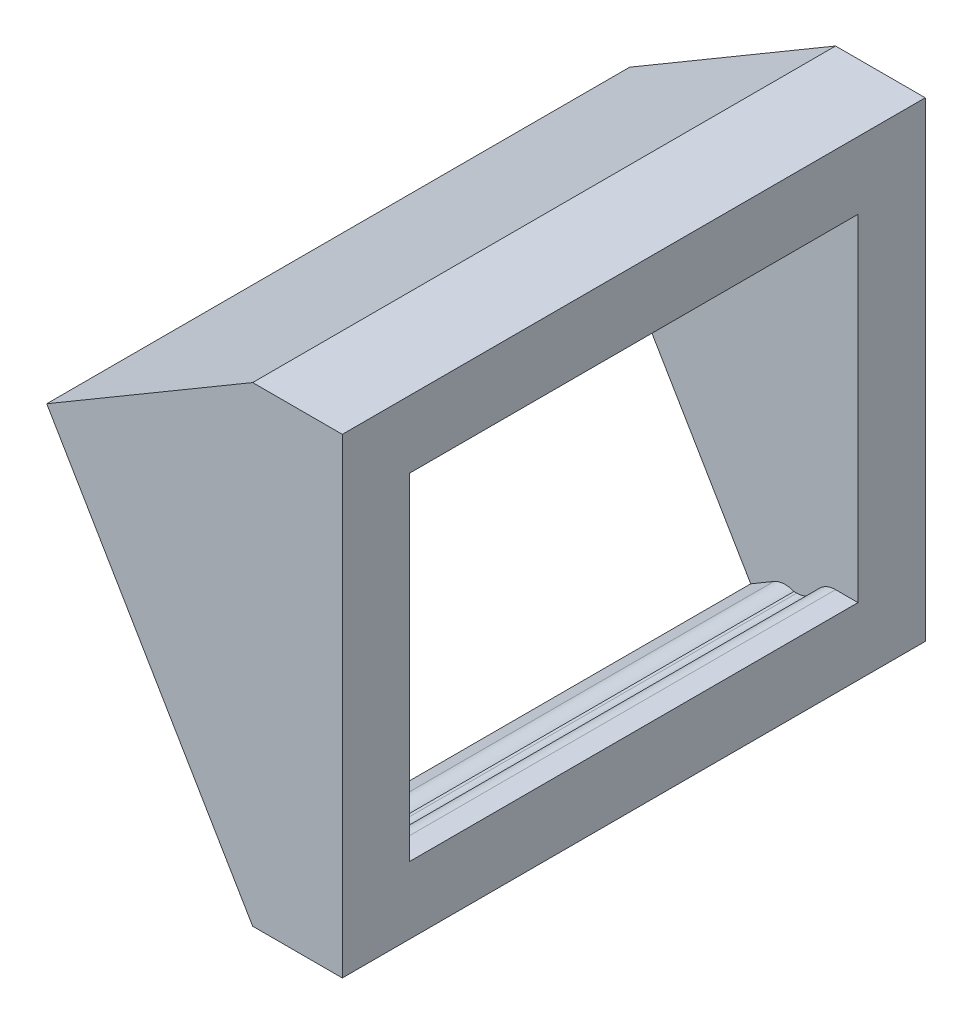
ISO-10303-21;
HEADER;
FILE_DESCRIPTION(('STEP AP214'),'2;1');
FILE_NAME('part.step','',(''),(''),'','','');
FILE_SCHEMA(('AUTOMOTIVE_DESIGN { 1 0 10303 214 1 1 1 1 }'));
ENDSEC;
DATA;
#1=APPLICATION_CONTEXT('core data for automotive mechanical design processes');
#2=APPLICATION_PROTOCOL_DEFINITION('international standard','automotive_design',2000,#1);
#3=PRODUCT_CONTEXT('',#1,'mechanical');
#4=PRODUCT('Part','Part','',(#3));
#5=PRODUCT_RELATED_PRODUCT_CATEGORY('part','',(#4));
#6=PRODUCT_DEFINITION_FORMATION('','',#4);
#7=PRODUCT_DEFINITION_CONTEXT('part definition',#1,'design');
#8=PRODUCT_DEFINITION('design','',#6,#7);
#9=PRODUCT_DEFINITION_SHAPE('','',#8);
#10=(LENGTH_UNIT() NAMED_UNIT(*) SI_UNIT(.MILLI.,.METRE.));
#11=(NAMED_UNIT(*) PLANE_ANGLE_UNIT() SI_UNIT($,.RADIAN.));
#12=(NAMED_UNIT(*) SI_UNIT($,.STERADIAN.) SOLID_ANGLE_UNIT());
#13=UNCERTAINTY_MEASURE_WITH_UNIT(LENGTH_MEASURE(1.E-05),#10,'distance_accuracy_value','');
#14=(GEOMETRIC_REPRESENTATION_CONTEXT(3) GLOBAL_UNCERTAINTY_ASSIGNED_CONTEXT((#13)) GLOBAL_UNIT_ASSIGNED_CONTEXT((#10,
#11,#12)) REPRESENTATION_CONTEXT('',''));
#15=CARTESIAN_POINT('',(0.,0.,0.));
#16=DIRECTION('',(0.,0.,1.));
#17=DIRECTION('',(1.,0.,0.));
#18=AXIS2_PLACEMENT_3D('',#15,#16,#17);
#19=CARTESIAN_POINT('',(2.,1.,11.5));
#20=DIRECTION('',(0.,1.,0.));
#21=DIRECTION('',(0.,0.,1.));
#22=AXIS2_PLACEMENT_3D('',#19,#20,#21);
#23=PLANE('',#22);
#24=DIRECTION('',(1.,0.,0.));
#25=VECTOR('',#24,1.);
#26=CARTESIAN_POINT('',(2.,1.,11.5));
#27=LINE('',#26,#25);
#28=CARTESIAN_POINT('',(0.5715522227985,1.,11.5));
#29=VERTEX_POINT('',#28);
#30=CARTESIAN_POINT('',(0.633974596215562,1.,11.5));
#31=VERTEX_POINT('',#30);
#32=EDGE_CURVE('E256',#29,#31,#27,.T.);
#33=ORIENTED_EDGE('',*,*,#32,.T.);
#34=DIRECTION('',(0.,0.,-1.));
#35=VECTOR('',#34,1.);
#36=CARTESIAN_POINT('',(0.633974596215562,1.,1.5));
#37=LINE('',#36,#35);
#38=CARTESIAN_POINT('',(0.633974596215562,1.,1.5));
#39=VERTEX_POINT('',#38);
#40=EDGE_CURVE('E345',#31,#39,#37,.T.);
#41=ORIENTED_EDGE('',*,*,#40,.T.);
#42=DIRECTION('',(1.,0.,0.));
#43=VECTOR('',#42,1.);
#44=CARTESIAN_POINT('',(2.,1.,1.5));
#45=LINE('',#44,#43);
#46=CARTESIAN_POINT('',(0.5715522227985,1.,1.5));
#47=VERTEX_POINT('',#46);
#48=EDGE_CURVE('E255',#47,#39,#45,.T.);
#49=ORIENTED_EDGE('',*,*,#48,.F.);
#50=DIRECTION('',(0.,0.,-1.));
#51=VECTOR('',#50,1.);
#52=CARTESIAN_POINT('',(0.5715522227985,1.,11.5));
#53=LINE('',#52,#51);
#54=EDGE_CURVE('E265',#29,#47,#53,.T.);
#55=ORIENTED_EDGE('',*,*,#54,.F.);
#56=EDGE_LOOP('',(#33,#41,#49,#55));
#57=FACE_BOUND('',#56,.T.);
#58=ADVANCED_FACE('F63',(#57),#23,.T.);
#59=CARTESIAN_POINT('',(0.,9.5,11.5));
#60=DIRECTION('',(0.,-1.,0.));
#61=DIRECTION('',(0.,0.,-1.));
#62=AXIS2_PLACEMENT_3D('',#59,#60,#61);
#63=PLANE('',#62);
#64=DIRECTION('',(-1.,0.,0.));
#65=VECTOR('',#64,1.);
#66=CARTESIAN_POINT('',(0.,9.5,1.5));
#67=LINE('',#66,#65);
#68=CARTESIAN_POINT('',(0.633974596215561,9.5,1.5));
#69=VERTEX_POINT('',#68);
#70=CARTESIAN_POINT('',(0.272627133216455,9.5,1.5));
#71=VERTEX_POINT('',#70);
#72=EDGE_CURVE('E268',#69,#71,#67,.T.);
#73=ORIENTED_EDGE('',*,*,#72,.F.);
#74=DIRECTION('',(0.,0.,1.));
#75=VECTOR('',#74,1.);
#76=CARTESIAN_POINT('',(0.633974596215561,9.5,11.5));
#77=LINE('',#76,#75);
#78=CARTESIAN_POINT('',(0.633974596215561,9.5,11.5));
#79=VERTEX_POINT('',#78);
#80=EDGE_CURVE('E339',#69,#79,#77,.T.);
#81=ORIENTED_EDGE('',*,*,#80,.T.);
#82=DIRECTION('',(-1.,0.,0.));
#83=VECTOR('',#82,1.);
#84=CARTESIAN_POINT('',(0.,9.5,11.5));
#85=LINE('',#84,#83);
#86=CARTESIAN_POINT('',(0.272627133216455,9.5,11.5));
#87=VERTEX_POINT('',#86);
#88=EDGE_CURVE('E259',#79,#87,#85,.T.);
#89=ORIENTED_EDGE('',*,*,#88,.T.);
#90=DIRECTION('',(0.,0.,-1.));
#91=VECTOR('',#90,1.);
#92=CARTESIAN_POINT('',(0.272627133216455,9.5,11.5));
#93=LINE('',#92,#91);
#94=EDGE_CURVE('E274',#87,#71,#93,.T.);
#95=ORIENTED_EDGE('',*,*,#94,.T.);
#96=EDGE_LOOP('',(#73,#81,#89,#95));
#97=FACE_BOUND('',#96,.T.);
#98=ADVANCED_FACE('F409',(#97),#63,.T.);
#99=CARTESIAN_POINT('',(-4.08418235971319,6.93368851358104,11.5));
#100=DIRECTION('',(0.507531692345614,-0.86163308969932,0.));
#101=DIRECTION('',(0.86163308969932,0.507531692345615,0.));
#102=AXIS2_PLACEMENT_3D('',#99,#100,#101);
#103=PLANE('',#102);
#104=DIRECTION('',(-0.86163308969932,-0.507531692345614,0.));
#105=VECTOR('',#104,1.);
#106=CARTESIAN_POINT('',(-4.08418235971319,6.93368851358104,11.5));
#107=LINE('',#106,#105);
#108=CARTESIAN_POINT('',(-2.86194020665817,7.65363141713484,11.5));
#109=VERTEX_POINT('',#108);
#110=EDGE_CURVE('E262',#87,#109,#107,.T.);
#111=ORIENTED_EDGE('',*,*,#110,.T.);
#112=DIRECTION('',(0.,0.,-1.));
#113=VECTOR('',#112,1.);
#114=CARTESIAN_POINT('',(-2.86194020665817,7.65363141713484,1.5));
#115=LINE('',#114,#113);
#116=CARTESIAN_POINT('',(-2.86194020665817,7.65363141713484,1.5));
#117=VERTEX_POINT('',#116);
#118=EDGE_CURVE('E350',#109,#117,#115,.T.);
#119=ORIENTED_EDGE('',*,*,#118,.T.);
#120=DIRECTION('',(-0.86163308969932,-0.507531692345614,0.));
#121=VECTOR('',#120,1.);
#122=CARTESIAN_POINT('',(-4.08418235971319,6.93368851358104,1.5));
#123=LINE('',#122,#121);
#124=EDGE_CURVE('E260',#71,#117,#123,.T.);
#125=ORIENTED_EDGE('',*,*,#124,.F.);
#126=ORIENTED_EDGE('',*,*,#94,.F.);
#127=EDGE_LOOP('',(#111,#119,#125,#126));
#128=FACE_BOUND('',#127,.T.);
#129=ADVANCED_FACE('F366',(#128),#103,.T.);
#130=CARTESIAN_POINT('',(0.,0.,11.5));
#131=DIRECTION('',(0.,0.,1.));
#132=DIRECTION('',(1.,0.,0.));
#133=AXIS2_PLACEMENT_3D('',#130,#131,#132);
#134=PLANE('',#133);
#135=ORIENTED_EDGE('',*,*,#88,.F.);
#136=CARTESIAN_POINT('',(0.633974596215561,9.,11.5));
#137=DIRECTION('',(0.,0.,1.));
#138=DIRECTION('',(1.,0.,0.));
#139=AXIS2_PLACEMENT_3D('',#136,#137,#138);
#140=CIRCLE('',#139,0.5);
#141=CARTESIAN_POINT('',(1.06698729810778,9.25,11.5));
#142=VERTEX_POINT('',#141);
#143=EDGE_CURVE('E343',#79,#142,#140,.F.);
#144=ORIENTED_EDGE('',*,*,#143,.T.);
#145=CARTESIAN_POINT('',(1.5,9.5,11.5));
#146=DIRECTION('',(0.,0.,1.));
#147=DIRECTION('',(1.,0.,0.));
#148=AXIS2_PLACEMENT_3D('',#145,#146,#147);
#149=CIRCLE('',#148,0.5);
#150=CARTESIAN_POINT('',(1.5,9.,11.5));
#151=VERTEX_POINT('',#150);
#152=EDGE_CURVE('E323',#142,#151,#149,.T.);
#153=ORIENTED_EDGE('',*,*,#152,.T.);
#154=DIRECTION('',(1.,0.,0.));
#155=VECTOR('',#154,1.);
#156=CARTESIAN_POINT('',(-11.5,9.,11.5));
#157=LINE('',#156,#155);
#158=CARTESIAN_POINT('',(2.,9.,11.5));
#159=VERTEX_POINT('',#158);
#160=EDGE_CURVE('E210',#151,#159,#157,.T.);
#161=ORIENTED_EDGE('',*,*,#160,.T.);
#162=DIRECTION('',(0.,-1.,0.));
#163=VECTOR('',#162,1.);
#164=CARTESIAN_POINT('',(2.,1.5,11.5));
#165=LINE('',#164,#163);
#166=CARTESIAN_POINT('',(2.,1.5,11.5));
#167=VERTEX_POINT('',#166);
#168=EDGE_CURVE('E225',#159,#167,#165,.T.);
#169=ORIENTED_EDGE('',*,*,#168,.T.);
#170=DIRECTION('',(1.,0.,0.));
#171=VECTOR('',#170,1.);
#172=CARTESIAN_POINT('',(-11.5,1.5,11.5));
#173=LINE('',#172,#171);
#174=CARTESIAN_POINT('',(1.5,1.5,11.5));
#175=VERTEX_POINT('',#174);
#176=EDGE_CURVE('E243',#175,#167,#173,.T.);
#177=ORIENTED_EDGE('',*,*,#176,.F.);
#178=CARTESIAN_POINT('',(1.5,0.999999999999999,11.5));
#179=DIRECTION('',(0.,0.,1.));
#180=DIRECTION('',(1.,0.,0.));
#181=AXIS2_PLACEMENT_3D('',#178,#179,#180);
#182=CIRCLE('',#181,0.5);
#183=CARTESIAN_POINT('',(1.06698729810778,1.25,11.5));
#184=VERTEX_POINT('',#183);
#185=EDGE_CURVE('E329',#175,#184,#182,.T.);
#186=ORIENTED_EDGE('',*,*,#185,.T.);
#187=CARTESIAN_POINT('',(0.633974596215562,1.5,11.5));
#188=DIRECTION('',(0.,0.,1.));
#189=DIRECTION('',(1.,0.,0.));
#190=AXIS2_PLACEMENT_3D('',#187,#188,#189);
#191=CIRCLE('',#190,0.5);
#192=EDGE_CURVE('E341',#184,#31,#191,.F.);
#193=ORIENTED_EDGE('',*,*,#192,.T.);
#194=ORIENTED_EDGE('',*,*,#32,.F.);
#195=CARTESIAN_POINT('',(0.376833029105326,0.539473740588574,11.5));
#196=DIRECTION('',(0.,0.,1.));
#197=DIRECTION('',(1.,0.,0.));
#198=AXIS2_PLACEMENT_3D('',#195,#196,#197);
#199=CIRCLE('',#198,0.5);
#200=CARTESIAN_POINT('',(0.123067182932517,0.970290285438232,11.5));
#201=VERTEX_POINT('',#200);
#202=EDGE_CURVE('E71',#29,#201,#199,.T.);
#203=ORIENTED_EDGE('',*,*,#202,.T.);
#204=DIRECTION('',(-0.86163308969932,-0.507531692345615,0.));
#205=VECTOR('',#204,1.);
#206=CARTESIAN_POINT('',(11.2394335312075,7.51821456193354,11.5));
#207=LINE('',#206,#205);
#208=CARTESIAN_POINT('',(-0.392613179733349,0.666536715267733,11.5));
#209=VERTEX_POINT('',#208);
#210=EDGE_CURVE('E233',#201,#209,#207,.T.);
#211=ORIENTED_EDGE('',*,*,#210,.T.);
#212=DIRECTION('',(-0.507531692345615,0.86163308969932,0.));
#213=VECTOR('',#212,1.);
#214=CARTESIAN_POINT('',(-0.392613179733349,0.666536715267733,11.5));
#215=LINE('',#214,#213);
#216=CARTESIAN_POINT('',(-4.19910087232546,7.12878488801263,11.5));
#217=VERTEX_POINT('',#216);
#218=EDGE_CURVE('E234',#209,#217,#215,.T.);
#219=ORIENTED_EDGE('',*,*,#218,.T.);
#220=DIRECTION('',(-0.86163308969932,-0.507531692345615,0.));
#221=VECTOR('',#220,1.);
#222=CARTESIAN_POINT('',(7.43294583861536,13.9804627346784,11.5));
#223=LINE('',#222,#221);
#224=CARTESIAN_POINT('',(-3.33746778262614,7.63631658035825,11.5));
#225=VERTEX_POINT('',#224);
#226=EDGE_CURVE('E248',#225,#217,#223,.T.);
#227=ORIENTED_EDGE('',*,*,#226,.F.);
#228=CARTESIAN_POINT('',(-3.11570605283098,8.0844479619845,11.5));
#229=DIRECTION('',(0.,0.,1.));
#230=DIRECTION('',(1.,0.,0.));
#231=AXIS2_PLACEMENT_3D('',#228,#229,#230);
#232=CIRCLE('',#231,0.5);
#233=EDGE_CURVE('E356',#225,#109,#232,.T.);
#234=ORIENTED_EDGE('',*,*,#233,.T.);
#235=ORIENTED_EDGE('',*,*,#110,.F.);
#236=EDGE_LOOP('',(#135,#144,#153,#161,#169,#177,#186,#193,#194,#203,#211,#219,#227,#234,#235));
#237=FACE_BOUND('',#236,.T.);
#238=ADVANCED_FACE('F361',(#237),#134,.F.);
#239=CARTESIAN_POINT('',(0.,0.,1.5));
#240=DIRECTION('',(0.,0.,1.));
#241=DIRECTION('',(1.,0.,0.));
#242=AXIS2_PLACEMENT_3D('',#239,#240,#241);
#243=PLANE('',#242);
#244=CARTESIAN_POINT('',(1.5,9.5,1.5));
#245=DIRECTION('',(0.,0.,1.));
#246=DIRECTION('',(1.,0.,0.));
#247=AXIS2_PLACEMENT_3D('',#244,#245,#246);
#248=CIRCLE('',#247,0.5);
#249=CARTESIAN_POINT('',(1.5,9.,1.5));
#250=VERTEX_POINT('',#249);
#251=CARTESIAN_POINT('',(1.06698729810778,9.25,1.5));
#252=VERTEX_POINT('',#251);
#253=EDGE_CURVE('E325',#250,#252,#248,.F.);
#254=ORIENTED_EDGE('',*,*,#253,.T.);
#255=CARTESIAN_POINT('',(0.633974596215561,9.,1.5));
#256=DIRECTION('',(0.,0.,1.));
#257=DIRECTION('',(1.,0.,0.));
#258=AXIS2_PLACEMENT_3D('',#255,#256,#257);
#259=CIRCLE('',#258,0.5);
#260=EDGE_CURVE('E337',#252,#69,#259,.T.);
#261=ORIENTED_EDGE('',*,*,#260,.T.);
#262=ORIENTED_EDGE('',*,*,#72,.T.);
#263=ORIENTED_EDGE('',*,*,#124,.T.);
#264=CARTESIAN_POINT('',(-3.11570605283098,8.0844479619845,1.5));
#265=DIRECTION('',(0.,0.,1.));
#266=DIRECTION('',(1.,0.,0.));
#267=AXIS2_PLACEMENT_3D('',#264,#265,#266);
#268=CIRCLE('',#267,0.5);
#269=CARTESIAN_POINT('',(-3.33746778262614,7.63631658035824,1.5));
#270=VERTEX_POINT('',#269);
#271=EDGE_CURVE('E354',#117,#270,#268,.F.);
#272=ORIENTED_EDGE('',*,*,#271,.T.);
#273=DIRECTION('',(-0.86163308969932,-0.507531692345615,0.));
#274=VECTOR('',#273,1.);
#275=CARTESIAN_POINT('',(7.43294583861536,13.9804627346784,1.5));
#276=LINE('',#275,#274);
#277=CARTESIAN_POINT('',(-4.19910087232546,7.12878488801263,1.5));
#278=VERTEX_POINT('',#277);
#279=EDGE_CURVE('E247',#270,#278,#276,.T.);
#280=ORIENTED_EDGE('',*,*,#279,.T.);
#281=DIRECTION('',(0.507531692345615,-0.86163308969932,0.));
#282=VECTOR('',#281,1.);
#283=CARTESIAN_POINT('',(-0.392613179733348,0.666536715267731,1.5));
#284=LINE('',#283,#282);
#285=CARTESIAN_POINT('',(-0.392613179733348,0.666536715267731,1.5));
#286=VERTEX_POINT('',#285);
#287=EDGE_CURVE('E240',#278,#286,#284,.T.);
#288=ORIENTED_EDGE('',*,*,#287,.T.);
#289=DIRECTION('',(-0.86163308969932,-0.507531692345615,0.));
#290=VECTOR('',#289,1.);
#291=CARTESIAN_POINT('',(11.2394335312075,7.51821456193353,1.5));
#292=LINE('',#291,#290);
#293=CARTESIAN_POINT('',(0.123067182932517,0.970290285438231,1.5));
#294=VERTEX_POINT('',#293);
#295=EDGE_CURVE('E251',#294,#286,#292,.T.);
#296=ORIENTED_EDGE('',*,*,#295,.F.);
#297=CARTESIAN_POINT('',(0.376833029105326,0.539473740588574,1.5));
#298=DIRECTION('',(0.,0.,1.));
#299=DIRECTION('',(1.,0.,0.));
#300=AXIS2_PLACEMENT_3D('',#297,#298,#299);
#301=CIRCLE('',#300,0.5);
#302=EDGE_CURVE('E12',#294,#47,#301,.F.);
#303=ORIENTED_EDGE('',*,*,#302,.T.);
#304=ORIENTED_EDGE('',*,*,#48,.T.);
#305=CARTESIAN_POINT('',(0.633974596215562,1.5,1.5));
#306=DIRECTION('',(0.,0.,1.));
#307=DIRECTION('',(1.,0.,0.));
#308=AXIS2_PLACEMENT_3D('',#305,#306,#307);
#309=CIRCLE('',#308,0.5);
#310=CARTESIAN_POINT('',(1.06698729810778,1.25,1.5));
#311=VERTEX_POINT('',#310);
#312=EDGE_CURVE('E335',#39,#311,#309,.T.);
#313=ORIENTED_EDGE('',*,*,#312,.T.);
#314=CARTESIAN_POINT('',(1.5,1.,1.5));
#315=DIRECTION('',(0.,0.,1.));
#316=DIRECTION('',(1.,0.,0.));
#317=AXIS2_PLACEMENT_3D('',#314,#315,#316);
#318=CIRCLE('',#317,0.5);
#319=CARTESIAN_POINT('',(1.5,1.5,1.5));
#320=VERTEX_POINT('',#319);
#321=EDGE_CURVE('E327',#311,#320,#318,.F.);
#322=ORIENTED_EDGE('',*,*,#321,.T.);
#323=DIRECTION('',(1.,0.,0.));
#324=VECTOR('',#323,1.);
#325=CARTESIAN_POINT('',(-11.5,1.5,1.5));
#326=LINE('',#325,#324);
#327=CARTESIAN_POINT('',(2.,1.5,1.5));
#328=VERTEX_POINT('',#327);
#329=EDGE_CURVE('E211',#320,#328,#326,.T.);
#330=ORIENTED_EDGE('',*,*,#329,.T.);
#331=DIRECTION('',(0.,1.,0.));
#332=VECTOR('',#331,1.);
#333=CARTESIAN_POINT('',(2.,1.5,1.5));
#334=LINE('',#333,#332);
#335=CARTESIAN_POINT('',(2.,9.,1.5));
#336=VERTEX_POINT('',#335);
#337=EDGE_CURVE('E214',#328,#336,#334,.T.);
#338=ORIENTED_EDGE('',*,*,#337,.T.);
#339=DIRECTION('',(1.,0.,0.));
#340=VECTOR('',#339,1.);
#341=CARTESIAN_POINT('',(-11.5,9.,1.5));
#342=LINE('',#341,#340);
#343=EDGE_CURVE('E198',#250,#336,#342,.T.);
#344=ORIENTED_EDGE('',*,*,#343,.F.);
#345=EDGE_LOOP('',(#254,#261,#262,#263,#272,#280,#288,#296,#303,#304,#313,#322,#330,#338,#344));
#346=FACE_BOUND('',#345,.T.);
#347=ADVANCED_FACE('F215',(#346),#243,.T.);
#348=CARTESIAN_POINT('',(11.2394335312075,7.51821456193353,1.5));
#349=DIRECTION('',(0.507531692345615,-0.86163308969932,0.));
#350=DIRECTION('',(0.86163308969932,0.507531692345615,0.));
#351=AXIS2_PLACEMENT_3D('',#348,#349,#350);
#352=PLANE('',#351);
#353=ORIENTED_EDGE('',*,*,#210,.F.);
#354=DIRECTION('',(0.,0.,1.));
#355=VECTOR('',#354,1.);
#356=CARTESIAN_POINT('',(0.123067182932517,0.970290285438231,1.5));
#357=LINE('',#356,#355);
#358=EDGE_CURVE('E84',#201,#294,#357,.F.);
#359=ORIENTED_EDGE('',*,*,#358,.T.);
#360=ORIENTED_EDGE('',*,*,#295,.T.);
#361=DIRECTION('',(0.,0.,1.));
#362=VECTOR('',#361,1.);
#363=CARTESIAN_POINT('',(-0.392613179733348,0.666536715267731,1.5));
#364=LINE('',#363,#362);
#365=EDGE_CURVE('E237',#286,#209,#364,.T.);
#366=ORIENTED_EDGE('',*,*,#365,.T.);
#367=EDGE_LOOP('',(#353,#359,#360,#366));
#368=FACE_BOUND('',#367,.T.);
#369=ADVANCED_FACE('F464',(#368),#352,.F.);
#370=CARTESIAN_POINT('',(7.43294583861536,13.9804627346784,1.5));
#371=DIRECTION('',(-0.507531692345615,0.86163308969932,0.));
#372=DIRECTION('',(-0.86163308969932,-0.507531692345615,0.));
#373=AXIS2_PLACEMENT_3D('',#370,#371,#372);
#374=PLANE('',#373);
#375=ORIENTED_EDGE('',*,*,#226,.T.);
#376=DIRECTION('',(0.,0.,-1.));
#377=VECTOR('',#376,1.);
#378=CARTESIAN_POINT('',(-4.19910087232546,7.12878488801263,1.5));
#379=LINE('',#378,#377);
#380=EDGE_CURVE('E231',#217,#278,#379,.T.);
#381=ORIENTED_EDGE('',*,*,#380,.T.);
#382=ORIENTED_EDGE('',*,*,#279,.F.);
#383=DIRECTION('',(0.,0.,-1.));
#384=VECTOR('',#383,1.);
#385=CARTESIAN_POINT('',(-3.33746778262614,7.63631658035824,1.5));
#386=LINE('',#385,#384);
#387=EDGE_CURVE('E244',#225,#270,#386,.T.);
#388=ORIENTED_EDGE('',*,*,#387,.F.);
#389=EDGE_LOOP('',(#375,#381,#382,#388));
#390=FACE_BOUND('',#389,.T.);
#391=ADVANCED_FACE('F372',(#390),#374,.F.);
#392=CARTESIAN_POINT('',(2.,0.,13.));
#393=DIRECTION('',(0.,1.,0.));
#394=DIRECTION('',(0.,0.,1.));
#395=AXIS2_PLACEMENT_3D('',#392,#393,#394);
#396=PLANE('',#395);
#397=DIRECTION('',(1.,0.,0.));
#398=VECTOR('',#397,1.);
#399=CARTESIAN_POINT('',(2.,0.,0.));
#400=LINE('',#399,#398);
#401=CARTESIAN_POINT('',(0.,0.,0.));
#402=VERTEX_POINT('',#401);
#403=CARTESIAN_POINT('',(2.,0.,0.));
#404=VERTEX_POINT('',#403);
#405=EDGE_CURVE('E277',#402,#404,#400,.T.);
#406=ORIENTED_EDGE('',*,*,#405,.T.);
#407=DIRECTION('',(0.,0.,-1.));
#408=VECTOR('',#407,1.);
#409=CARTESIAN_POINT('',(2.,0.,13.));
#410=LINE('',#409,#408);
#411=CARTESIAN_POINT('',(2.,0.,13.));
#412=VERTEX_POINT('',#411);
#413=EDGE_CURVE('E311',#412,#404,#410,.T.);
#414=ORIENTED_EDGE('',*,*,#413,.F.);
#415=DIRECTION('',(1.,0.,0.));
#416=VECTOR('',#415,1.);
#417=CARTESIAN_POINT('',(2.,0.,13.));
#418=LINE('',#417,#416);
#419=CARTESIAN_POINT('',(0.,0.,13.));
#420=VERTEX_POINT('',#419);
#421=EDGE_CURVE('E278',#420,#412,#418,.T.);
#422=ORIENTED_EDGE('',*,*,#421,.F.);
#423=DIRECTION('',(0.,0.,-1.));
#424=VECTOR('',#423,1.);
#425=CARTESIAN_POINT('',(0.,0.,13.));
#426=LINE('',#425,#424);
#427=EDGE_CURVE('E290',#420,#402,#426,.T.);
#428=ORIENTED_EDGE('',*,*,#427,.T.);
#429=EDGE_LOOP('',(#406,#414,#422,#428));
#430=FACE_BOUND('',#429,.T.);
#431=ADVANCED_FACE('F448',(#430),#396,.F.);
#432=CARTESIAN_POINT('',(2.,10.5,13.));
#433=DIRECTION('',(-1.,0.,0.));
#434=DIRECTION('',(0.,-1.,0.));
#435=AXIS2_PLACEMENT_3D('',#432,#433,#434);
#436=PLANE('',#435);
#437=ORIENTED_EDGE('',*,*,#337,.F.);
#438=DIRECTION('',(0.,0.,-1.));
#439=VECTOR('',#438,1.);
#440=CARTESIAN_POINT('',(2.,1.5,11.5));
#441=LINE('',#440,#439);
#442=EDGE_CURVE('E220',#167,#328,#441,.T.);
#443=ORIENTED_EDGE('',*,*,#442,.F.);
#444=ORIENTED_EDGE('',*,*,#168,.F.);
#445=DIRECTION('',(0.,0.,1.));
#446=VECTOR('',#445,1.);
#447=CARTESIAN_POINT('',(2.,9.,11.5));
#448=LINE('',#447,#446);
#449=EDGE_CURVE('E203',#336,#159,#448,.T.);
#450=ORIENTED_EDGE('',*,*,#449,.F.);
#451=EDGE_LOOP('',(#437,#443,#444,#450));
#452=FACE_BOUND('',#451,.T.);
#453=DIRECTION('',(0.,1.,0.));
#454=VECTOR('',#453,1.);
#455=CARTESIAN_POINT('',(2.,10.5,0.));
#456=LINE('',#455,#454);
#457=CARTESIAN_POINT('',(2.,10.5,0.));
#458=VERTEX_POINT('',#457);
#459=EDGE_CURVE('E293',#404,#458,#456,.T.);
#460=ORIENTED_EDGE('',*,*,#459,.T.);
#461=DIRECTION('',(0.,0.,-1.));
#462=VECTOR('',#461,1.);
#463=CARTESIAN_POINT('',(2.,10.5,13.));
#464=LINE('',#463,#462);
#465=CARTESIAN_POINT('',(2.,10.5,13.));
#466=VERTEX_POINT('',#465);
#467=EDGE_CURVE('E308',#466,#458,#464,.T.);
#468=ORIENTED_EDGE('',*,*,#467,.F.);
#469=DIRECTION('',(0.,1.,0.));
#470=VECTOR('',#469,1.);
#471=CARTESIAN_POINT('',(2.,10.5,13.));
#472=LINE('',#471,#470);
#473=EDGE_CURVE('E281',#412,#466,#472,.T.);
#474=ORIENTED_EDGE('',*,*,#473,.F.);
#475=ORIENTED_EDGE('',*,*,#413,.T.);
#476=EDGE_LOOP('',(#460,#468,#474,#475));
#477=FACE_BOUND('',#476,.T.);
#478=ADVANCED_FACE('F222',(#452,#477),#436,.F.);
#479=CARTESIAN_POINT('',(0.,10.5,13.));
#480=DIRECTION('',(0.,-1.,0.));
#481=DIRECTION('',(0.,0.,-1.));
#482=AXIS2_PLACEMENT_3D('',#479,#480,#481);
#483=PLANE('',#482);
#484=DIRECTION('',(-1.,0.,0.));
#485=VECTOR('',#484,1.);
#486=CARTESIAN_POINT('',(0.,10.5,0.));
#487=LINE('',#486,#485);
#488=CARTESIAN_POINT('',(0.,10.5,0.));
#489=VERTEX_POINT('',#488);
#490=EDGE_CURVE('E295',#458,#489,#487,.T.);
#491=ORIENTED_EDGE('',*,*,#490,.T.);
#492=DIRECTION('',(0.,0.,-1.));
#493=VECTOR('',#492,1.);
#494=CARTESIAN_POINT('',(0.,10.5,13.));
#495=LINE('',#494,#493);
#496=CARTESIAN_POINT('',(0.,10.5,13.));
#497=VERTEX_POINT('',#496);
#498=EDGE_CURVE('E305',#497,#489,#495,.T.);
#499=ORIENTED_EDGE('',*,*,#498,.F.);
#500=DIRECTION('',(-1.,0.,0.));
#501=VECTOR('',#500,1.);
#502=CARTESIAN_POINT('',(0.,10.5,13.));
#503=LINE('',#502,#501);
#504=EDGE_CURVE('E284',#466,#497,#503,.T.);
#505=ORIENTED_EDGE('',*,*,#504,.F.);
#506=ORIENTED_EDGE('',*,*,#467,.T.);
#507=EDGE_LOOP('',(#491,#499,#505,#506));
#508=FACE_BOUND('',#507,.T.);
#509=ADVANCED_FACE('F441',(#508),#483,.F.);
#510=CARTESIAN_POINT('',(-4.59171405205881,7.79532160328036,13.));
#511=DIRECTION('',(0.507531692345615,-0.86163308969932,0.));
#512=DIRECTION('',(0.86163308969932,0.507531692345615,0.));
#513=AXIS2_PLACEMENT_3D('',#510,#511,#512);
#514=PLANE('',#513);
#515=DIRECTION('',(-0.86163308969932,-0.507531692345615,0.));
#516=VECTOR('',#515,1.);
#517=CARTESIAN_POINT('',(-4.59171405205881,7.79532160328036,0.));
#518=LINE('',#517,#516);
#519=CARTESIAN_POINT('',(-4.59171405205881,7.79532160328036,0.));
#520=VERTEX_POINT('',#519);
#521=EDGE_CURVE('E297',#489,#520,#518,.T.);
#522=ORIENTED_EDGE('',*,*,#521,.T.);
#523=DIRECTION('',(0.,0.,-1.));
#524=VECTOR('',#523,1.);
#525=CARTESIAN_POINT('',(-4.59171405205881,7.79532160328036,13.));
#526=LINE('',#525,#524);
#527=CARTESIAN_POINT('',(-4.59171405205881,7.79532160328036,13.));
#528=VERTEX_POINT('',#527);
#529=EDGE_CURVE('E302',#528,#520,#526,.T.);
#530=ORIENTED_EDGE('',*,*,#529,.F.);
#531=DIRECTION('',(-0.86163308969932,-0.507531692345615,0.));
#532=VECTOR('',#531,1.);
#533=CARTESIAN_POINT('',(-4.59171405205881,7.79532160328036,13.));
#534=LINE('',#533,#532);
#535=EDGE_CURVE('E286',#497,#528,#534,.T.);
#536=ORIENTED_EDGE('',*,*,#535,.F.);
#537=ORIENTED_EDGE('',*,*,#498,.T.);
#538=EDGE_LOOP('',(#522,#530,#536,#537));
#539=FACE_BOUND('',#538,.T.);
#540=ADVANCED_FACE('F438',(#539),#514,.F.);
#541=CARTESIAN_POINT('',(0.,0.,13.));
#542=DIRECTION('',(0.86163308969932,0.507531692345615,0.));
#543=DIRECTION('',(-0.507531692345615,0.86163308969932,0.));
#544=AXIS2_PLACEMENT_3D('',#541,#542,#543);
#545=PLANE('',#544);
#546=ORIENTED_EDGE('',*,*,#218,.F.);
#547=ORIENTED_EDGE('',*,*,#365,.F.);
#548=ORIENTED_EDGE('',*,*,#287,.F.);
#549=ORIENTED_EDGE('',*,*,#380,.F.);
#550=EDGE_LOOP('',(#546,#547,#548,#549));
#551=FACE_BOUND('',#550,.T.);
#552=DIRECTION('',(0.507531692345615,-0.86163308969932,0.));
#553=VECTOR('',#552,1.);
#554=CARTESIAN_POINT('',(0.,0.,0.));
#555=LINE('',#554,#553);
#556=EDGE_CURVE('E282',#520,#402,#555,.T.);
#557=ORIENTED_EDGE('',*,*,#556,.T.);
#558=ORIENTED_EDGE('',*,*,#427,.F.);
#559=DIRECTION('',(0.507531692345615,-0.86163308969932,0.));
#560=VECTOR('',#559,1.);
#561=CARTESIAN_POINT('',(0.,0.,13.));
#562=LINE('',#561,#560);
#563=EDGE_CURVE('E288',#528,#420,#562,.T.);
#564=ORIENTED_EDGE('',*,*,#563,.F.);
#565=ORIENTED_EDGE('',*,*,#529,.T.);
#566=EDGE_LOOP('',(#557,#558,#564,#565));
#567=FACE_BOUND('',#566,.T.);
#568=ADVANCED_FACE('F376',(#551,#567),#545,.F.);
#569=CARTESIAN_POINT('',(0.,0.,13.));
#570=DIRECTION('',(0.,0.,1.));
#571=DIRECTION('',(1.,0.,0.));
#572=AXIS2_PLACEMENT_3D('',#569,#570,#571);
#573=PLANE('',#572);
#574=ORIENTED_EDGE('',*,*,#421,.T.);
#575=ORIENTED_EDGE('',*,*,#473,.T.);
#576=ORIENTED_EDGE('',*,*,#504,.T.);
#577=ORIENTED_EDGE('',*,*,#535,.T.);
#578=ORIENTED_EDGE('',*,*,#563,.T.);
#579=EDGE_LOOP('',(#574,#575,#576,#577,#578));
#580=FACE_BOUND('',#579,.T.);
#581=ADVANCED_FACE('F428',(#580),#573,.T.);
#582=CARTESIAN_POINT('',(0.,0.,0.));
#583=DIRECTION('',(0.,0.,1.));
#584=DIRECTION('',(1.,0.,0.));
#585=AXIS2_PLACEMENT_3D('',#582,#583,#584);
#586=PLANE('',#585);
#587=ORIENTED_EDGE('',*,*,#405,.F.);
#588=ORIENTED_EDGE('',*,*,#556,.F.);
#589=ORIENTED_EDGE('',*,*,#521,.F.);
#590=ORIENTED_EDGE('',*,*,#490,.F.);
#591=ORIENTED_EDGE('',*,*,#459,.F.);
#592=EDGE_LOOP('',(#587,#588,#589,#590,#591));
#593=FACE_BOUND('',#592,.T.);
#594=ADVANCED_FACE('F431',(#593),#586,.F.);
#595=CARTESIAN_POINT('',(-11.5,1.5,11.5));
#596=DIRECTION('',(0.,-1.,0.));
#597=DIRECTION('',(0.,0.,-1.));
#598=AXIS2_PLACEMENT_3D('',#595,#596,#597);
#599=PLANE('',#598);
#600=ORIENTED_EDGE('',*,*,#329,.F.);
#601=DIRECTION('',(0.,0.,-1.));
#602=VECTOR('',#601,1.);
#603=CARTESIAN_POINT('',(1.5,1.5,11.5));
#604=LINE('',#603,#602);
#605=EDGE_CURVE('E321',#320,#175,#604,.F.);
#606=ORIENTED_EDGE('',*,*,#605,.T.);
#607=ORIENTED_EDGE('',*,*,#176,.T.);
#608=ORIENTED_EDGE('',*,*,#442,.T.);
#609=EDGE_LOOP('',(#600,#606,#607,#608));
#610=FACE_BOUND('',#609,.T.);
#611=ADVANCED_FACE('F396',(#610),#599,.F.);
#612=CARTESIAN_POINT('',(-11.5,9.,11.5));
#613=DIRECTION('',(0.,1.,0.));
#614=DIRECTION('',(0.,0.,1.));
#615=AXIS2_PLACEMENT_3D('',#612,#613,#614);
#616=PLANE('',#615);
#617=ORIENTED_EDGE('',*,*,#160,.F.);
#618=DIRECTION('',(0.,0.,1.));
#619=VECTOR('',#618,1.);
#620=CARTESIAN_POINT('',(1.5,9.,1.5));
#621=LINE('',#620,#619);
#622=EDGE_CURVE('E206',#151,#250,#621,.F.);
#623=ORIENTED_EDGE('',*,*,#622,.T.);
#624=ORIENTED_EDGE('',*,*,#343,.T.);
#625=ORIENTED_EDGE('',*,*,#449,.T.);
#626=EDGE_LOOP('',(#617,#623,#624,#625));
#627=FACE_BOUND('',#626,.T.);
#628=ADVANCED_FACE('F201',(#627),#616,.F.);
#629=CARTESIAN_POINT('',(1.5,9.5,11.5));
#630=DIRECTION('',(0.,0.,-1.));
#631=DIRECTION('',(-1.,0.,0.));
#632=AXIS2_PLACEMENT_3D('',#629,#630,#631);
#633=CYLINDRICAL_SURFACE('',#632,0.5);
#634=ORIENTED_EDGE('',*,*,#152,.F.);
#635=DIRECTION('',(0.,0.,-1.));
#636=VECTOR('',#635,1.);
#637=CARTESIAN_POINT('',(1.06698729810778,9.25,11.5));
#638=LINE('',#637,#636);
#639=EDGE_CURVE('E332',#142,#252,#638,.T.);
#640=ORIENTED_EDGE('',*,*,#639,.T.);
#641=ORIENTED_EDGE('',*,*,#253,.F.);
#642=ORIENTED_EDGE('',*,*,#622,.F.);
#643=EDGE_LOOP('',(#634,#640,#641,#642));
#644=FACE_BOUND('',#643,.T.);
#645=ADVANCED_FACE('F403',(#644),#633,.T.);
#646=CARTESIAN_POINT('',(1.5,0.999999999999999,11.5));
#647=DIRECTION('',(0.,0.,1.));
#648=DIRECTION('',(0.,-1.,0.));
#649=AXIS2_PLACEMENT_3D('',#646,#647,#648);
#650=CYLINDRICAL_SURFACE('',#649,0.5);
#651=ORIENTED_EDGE('',*,*,#321,.F.);
#652=DIRECTION('',(0.,0.,1.));
#653=VECTOR('',#652,1.);
#654=CARTESIAN_POINT('',(1.06698729810778,1.25,11.5));
#655=LINE('',#654,#653);
#656=EDGE_CURVE('E348',#311,#184,#655,.T.);
#657=ORIENTED_EDGE('',*,*,#656,.T.);
#658=ORIENTED_EDGE('',*,*,#185,.F.);
#659=ORIENTED_EDGE('',*,*,#605,.F.);
#660=EDGE_LOOP('',(#651,#657,#658,#659));
#661=FACE_BOUND('',#660,.T.);
#662=ADVANCED_FACE('F394',(#661),#650,.T.);
#663=CARTESIAN_POINT('',(0.633974596215561,9.,11.5));
#664=DIRECTION('',(0.,0.,-1.));
#665=DIRECTION('',(-1.,0.,0.));
#666=AXIS2_PLACEMENT_3D('',#663,#664,#665);
#667=CYLINDRICAL_SURFACE('',#666,0.5);
#668=ORIENTED_EDGE('',*,*,#143,.F.);
#669=ORIENTED_EDGE('',*,*,#80,.F.);
#670=ORIENTED_EDGE('',*,*,#260,.F.);
#671=ORIENTED_EDGE('',*,*,#639,.F.);
#672=EDGE_LOOP('',(#668,#669,#670,#671));
#673=FACE_BOUND('',#672,.T.);
#674=ADVANCED_FACE('F411',(#673),#667,.F.);
#675=CARTESIAN_POINT('',(0.633974596215562,1.5,11.5));
#676=DIRECTION('',(0.,0.,1.));
#677=DIRECTION('',(0.,-1.,0.));
#678=AXIS2_PLACEMENT_3D('',#675,#676,#677);
#679=CYLINDRICAL_SURFACE('',#678,0.5);
#680=ORIENTED_EDGE('',*,*,#192,.F.);
#681=ORIENTED_EDGE('',*,*,#656,.F.);
#682=ORIENTED_EDGE('',*,*,#312,.F.);
#683=ORIENTED_EDGE('',*,*,#40,.F.);
#684=EDGE_LOOP('',(#680,#681,#682,#683));
#685=FACE_BOUND('',#684,.T.);
#686=ADVANCED_FACE('F390',(#685),#679,.F.);
#687=CARTESIAN_POINT('',(-3.11570605283098,8.0844479619845,11.5));
#688=DIRECTION('',(0.,0.,1.));
#689=DIRECTION('',(0.,-1.,0.));
#690=AXIS2_PLACEMENT_3D('',#687,#688,#689);
#691=CYLINDRICAL_SURFACE('',#690,0.5);
#692=ORIENTED_EDGE('',*,*,#233,.F.);
#693=ORIENTED_EDGE('',*,*,#387,.T.);
#694=ORIENTED_EDGE('',*,*,#271,.F.);
#695=ORIENTED_EDGE('',*,*,#118,.F.);
#696=EDGE_LOOP('',(#692,#693,#694,#695));
#697=FACE_BOUND('',#696,.T.);
#698=ADVANCED_FACE('F368',(#697),#691,.T.);
#699=CARTESIAN_POINT('',(0.376833029105326,0.539473740588574,11.5));
#700=DIRECTION('',(0.,0.,1.));
#701=DIRECTION('',(1.,0.,0.));
#702=AXIS2_PLACEMENT_3D('',#699,#700,#701);
#703=CYLINDRICAL_SURFACE('',#702,0.5);
#704=ORIENTED_EDGE('',*,*,#302,.F.);
#705=ORIENTED_EDGE('',*,*,#358,.F.);
#706=ORIENTED_EDGE('',*,*,#202,.F.);
#707=ORIENTED_EDGE('',*,*,#54,.T.);
#708=EDGE_LOOP('',(#704,#705,#706,#707));
#709=FACE_BOUND('',#708,.T.);
#710=ADVANCED_FACE('F65',(#709),#703,.T.);
#711=CLOSED_SHELL('',(#58,#98,#129,#238,#347,#369,#391,#431,#478,#509,#540,#568,#581,#594,#611,
#628,#645,#662,#674,#686,#698,#710));
#712=MANIFOLD_SOLID_BREP('B2',#711);
#713=ADVANCED_BREP_SHAPE_REPRESENTATION('',(#18,#712),#14);
#714=SHAPE_DEFINITION_REPRESENTATION(#9,#713);
ENDSEC;
END-ISO-10303-21;
